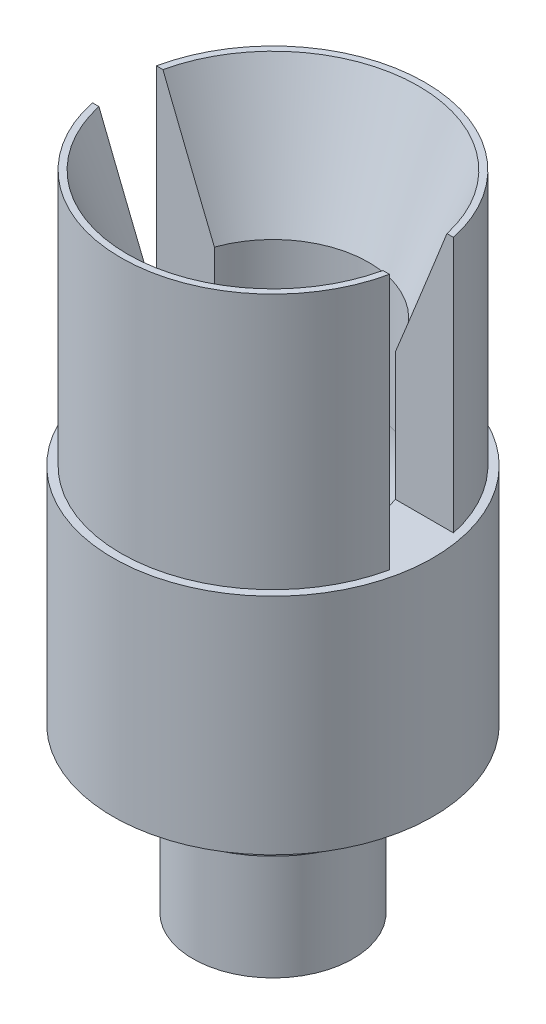
ISO-10303-21;
HEADER;
FILE_DESCRIPTION(('STEP AP214'),'2;1');
FILE_NAME('part.step','',(''),(''),'','','');
FILE_SCHEMA(('AUTOMOTIVE_DESIGN { 1 0 10303 214 1 1 1 1 }'));
ENDSEC;
DATA;
#1=APPLICATION_CONTEXT('core data for automotive mechanical design processes');
#2=APPLICATION_PROTOCOL_DEFINITION('international standard','automotive_design',2000,#1);
#3=PRODUCT_CONTEXT('',#1,'mechanical');
#4=PRODUCT('Part','Part','',(#3));
#5=PRODUCT_RELATED_PRODUCT_CATEGORY('part','',(#4));
#6=PRODUCT_DEFINITION_FORMATION('','',#4);
#7=PRODUCT_DEFINITION_CONTEXT('part definition',#1,'design');
#8=PRODUCT_DEFINITION('design','',#6,#7);
#9=PRODUCT_DEFINITION_SHAPE('','',#8);
#10=(LENGTH_UNIT() NAMED_UNIT(*) SI_UNIT(.MILLI.,.METRE.));
#11=(NAMED_UNIT(*) PLANE_ANGLE_UNIT() SI_UNIT($,.RADIAN.));
#12=(NAMED_UNIT(*) SI_UNIT($,.STERADIAN.) SOLID_ANGLE_UNIT());
#13=UNCERTAINTY_MEASURE_WITH_UNIT(LENGTH_MEASURE(1.E-05),#10,'distance_accuracy_value','');
#14=(GEOMETRIC_REPRESENTATION_CONTEXT(3) GLOBAL_UNCERTAINTY_ASSIGNED_CONTEXT((#13)) GLOBAL_UNIT_ASSIGNED_CONTEXT((#10,
#11,#12)) REPRESENTATION_CONTEXT('',''));
#15=CARTESIAN_POINT('',(0.,0.,0.));
#16=DIRECTION('',(0.,0.,1.));
#17=DIRECTION('',(1.,0.,0.));
#18=AXIS2_PLACEMENT_3D('',#15,#16,#17);
#19=CARTESIAN_POINT('',(0.,-1.29258552445077,0.));
#20=DIRECTION('',(0.,-1.,0.));
#21=DIRECTION('',(0.,0.,-1.));
#22=AXIS2_PLACEMENT_3D('',#19,#20,#21);
#23=CYLINDRICAL_SURFACE('',#22,3.);
#24=CARTESIAN_POINT('',(0.,16.1,0.));
#25=DIRECTION('',(0.,-1.,0.));
#26=DIRECTION('',(0.,0.,-1.));
#27=AXIS2_PLACEMENT_3D('',#24,#25,#26);
#28=CIRCLE('',#27,3.);
#29=CARTESIAN_POINT('',(-2.82842712474619,16.1,-1.));
#30=VERTEX_POINT('',#29);
#31=CARTESIAN_POINT('',(2.82842712474619,16.1,-1.));
#32=VERTEX_POINT('',#31);
#33=EDGE_CURVE('E142',#30,#32,#28,.T.);
#34=ORIENTED_EDGE('',*,*,#33,.F.);
#35=DIRECTION('',(0.,-1.,0.));
#36=VECTOR('',#35,1.);
#37=CARTESIAN_POINT('',(-2.82842712474619,-1.29258552445077,-1.));
#38=LINE('',#37,#36);
#39=CARTESIAN_POINT('',(-2.82842712474619,12.1,-1.));
#40=VERTEX_POINT('',#39);
#41=EDGE_CURVE('E116',#40,#30,#38,.F.);
#42=ORIENTED_EDGE('',*,*,#41,.F.);
#43=CARTESIAN_POINT('',(0.,12.1,0.));
#44=DIRECTION('',(0.,-1.,0.));
#45=DIRECTION('',(0.,0.,-1.));
#46=AXIS2_PLACEMENT_3D('',#43,#44,#45);
#47=CIRCLE('',#46,3.);
#48=CARTESIAN_POINT('',(2.82842712474619,12.1,-1.));
#49=VERTEX_POINT('',#48);
#50=EDGE_CURVE('E41',#40,#49,#47,.T.);
#51=ORIENTED_EDGE('',*,*,#50,.T.);
#52=DIRECTION('',(0.,-1.,0.));
#53=VECTOR('',#52,1.);
#54=CARTESIAN_POINT('',(2.82842712474619,-1.29258552445077,-1.));
#55=LINE('',#54,#53);
#56=EDGE_CURVE('E162',#49,#32,#55,.F.);
#57=ORIENTED_EDGE('',*,*,#56,.T.);
#58=EDGE_LOOP('',(#34,#42,#51,#57));
#59=FACE_BOUND('',#58,.T.);
#60=ADVANCED_FACE('F32',(#59),#23,.F.);
#61=CARTESIAN_POINT('',(0.,16.1,0.));
#62=DIRECTION('',(0.,1.,0.));
#63=DIRECTION('',(0.,0.,1.));
#64=AXIS2_PLACEMENT_3D('',#61,#62,#63);
#65=CONICAL_SURFACE('',#64,3.,0.369684288795301);
#66=CARTESIAN_POINT('',(0.,20.1,0.));
#67=DIRECTION('',(0.,-1.,0.));
#68=DIRECTION('',(0.,0.,-1.));
#69=AXIS2_PLACEMENT_3D('',#66,#67,#68);
#70=CIRCLE('',#69,4.55);
#71=CARTESIAN_POINT('',(-4.43874982399324,20.1,-1.));
#72=VERTEX_POINT('',#71);
#73=CARTESIAN_POINT('',(4.43874982399324,20.1,-1.));
#74=VERTEX_POINT('',#73);
#75=EDGE_CURVE('E136',#72,#74,#70,.T.);
#76=ORIENTED_EDGE('',*,*,#75,.F.);
#77=CARTESIAN_POINT('',(-1.42130511274065,12.8428280186664,-1.));
#78=CARTESIAN_POINT('',(-1.46687249735341,12.939038396171,-1.));
#79=CARTESIAN_POINT('',(-1.51187462449016,13.0355137045895,-1.));
#80=CARTESIAN_POINT('',(-1.60094963701557,13.2288890425911,-1.));
#81=CARTESIAN_POINT('',(-1.645022551832,13.3257890586062,-1.));
#82=CARTESIAN_POINT('',(-1.73243931522254,13.5199059879894,-1.));
#83=CARTESIAN_POINT('',(-1.77578322952742,13.617122871833,-1.));
#84=CARTESIAN_POINT('',(-1.8618790255143,13.8118192828097,-1.));
#85=CARTESIAN_POINT('',(-1.90463090174485,13.9092988123513,-1.));
#86=CARTESIAN_POINT('',(-2.03214641427029,14.2020169637841,-1.));
#87=CARTESIAN_POINT('',(-2.11618594382117,14.3975709275732,-1.));
#88=CARTESIAN_POINT('',(-2.28291151732341,14.7892594233278,-1.));
#89=CARTESIAN_POINT('',(-2.36559752403552,14.9853939710921,-1.));
#90=CARTESIAN_POINT('',(-2.53835038856168,15.3980946633329,-1.));
#91=CARTESIAN_POINT('',(-2.62831042752032,15.6147054841046,-1.));
#92=CARTESIAN_POINT('',(-2.80733548677005,16.0482936464627,-1.));
#93=CARTESIAN_POINT('',(-2.8964005157964,16.2652709844478,-1.));
#94=CARTESIAN_POINT('',(-3.16260720888507,16.9166581585263,-1.));
#95=CARTESIAN_POINT('',(-3.33874219795971,17.3514792002581,-1.));
#96=CARTESIAN_POINT('',(-3.68122880215228,18.2015891497653,-1.));
#97=CARTESIAN_POINT('',(-3.84765510788972,18.6168480492094,-1.));
#98=CARTESIAN_POINT('',(-4.17948286982598,19.4477753704594,-1.));
#99=CARTESIAN_POINT('',(-4.34488432522826,19.8634437925831,-1.));
#100=CARTESIAN_POINT('',(-4.6749259280216,20.6949664518623,-1.));
#101=CARTESIAN_POINT('',(-4.83956624944985,21.1108206199982,-1.));
#102=CARTESIAN_POINT('',(-5.16830298988397,21.9427421353563,-1.));
#103=CARTESIAN_POINT('',(-5.33239941091285,22.3588094817789,-1.));
#104=CARTESIAN_POINT('',(-5.49631311474116,22.774948560548,-1.));
#105=B_SPLINE_CURVE_WITH_KNOTS('',3,(#77,#78,#79,#80,#81,#82,#83,#84,#85,#86,#87,#88,#89,#90,
#91,#92,#93,#94,#95,#96,#97,#98,#99,#100,#101,#102,#103,#104),.UNSPECIFIED.,.F.,.F.,(4,2,2,2,2,
2,2,2,2,2,2,2,2,4),(0.,0.319361743391871,0.638713357494175,0.958036021007213,1.27736162286758,
1.91589524012645,2.55444639583225,3.25808939331585,3.96172551659021,5.3691405737959,
6.71124163388514,8.05334373698743,9.39512206142562,10.7368953895948),.UNSPECIFIED.);
#106=EDGE_CURVE('E111',#30,#72,#105,.T.);
#107=ORIENTED_EDGE('',*,*,#106,.F.);
#108=ORIENTED_EDGE('',*,*,#33,.T.);
#109=CARTESIAN_POINT('',(1.13854452280354,12.2686434650191,-1.));
#110=CARTESIAN_POINT('',(1.18110951610829,12.3512325143624,-1.));
#111=CARTESIAN_POINT('',(1.22289842755637,12.4342148407254,-1.));
#112=CARTESIAN_POINT('',(1.30521868303787,12.6007935396711,-1.));
#113=CARTESIAN_POINT('',(1.34575012842566,12.6843898620894,-1.));
#114=CARTESIAN_POINT('',(1.42584827978096,12.8520195506229,-1.));
#115=CARTESIAN_POINT('',(1.46541518987714,12.9360528196167,-1.));
#116=CARTESIAN_POINT('',(1.54378038572998,13.1044789405277,-1.));
#117=CARTESIAN_POINT('',(1.58257865345234,13.1888718008256,-1.));
#118=CARTESIAN_POINT('',(1.69801546041434,13.4424039413404,-1.));
#119=CARTESIAN_POINT('',(1.77372805785886,13.611964538265,-1.));
#120=CARTESIAN_POINT('',(1.92345995952192,13.9518410420272,-1.));
#121=CARTESIAN_POINT('',(1.99747915472072,14.122156996656,-1.));
#122=CARTESIAN_POINT('',(2.15085392894309,14.4785810096356,-1.));
#123=CARTESIAN_POINT('',(2.23009439398268,14.6647385442718,-1.));
#124=CARTESIAN_POINT('',(2.387503160546,15.0375003295142,-1.));
#125=CARTESIAN_POINT('',(2.46567148688999,15.2241045696613,-1.));
#126=CARTESIAN_POINT('',(2.69900152607198,15.7844668620993,-1.));
#127=CARTESIAN_POINT('',(2.8529663225196,16.1587229526121,-1.));
#128=CARTESIAN_POINT('',(3.15259808166099,16.8924611974718,-1.));
#129=CARTESIAN_POINT('',(3.29834404718119,17.2519112122027,-1.));
#130=CARTESIAN_POINT('',(3.58862413115508,17.9712999194609,-1.));
#131=CARTESIAN_POINT('',(3.73315824992082,18.3312386118623,-1.));
#132=CARTESIAN_POINT('',(4.02136485780308,19.051432353474,-1.));
#133=CARTESIAN_POINT('',(4.16503740421451,19.4116873797797,-1.));
#134=CARTESIAN_POINT('',(4.45175430338885,20.1324470655695,-1.));
#135=CARTESIAN_POINT('',(4.59479865639335,20.4929517249576,-1.));
#136=CARTESIAN_POINT('',(5.0812789872747,21.7212937548631,-1.));
#137=CARTESIAN_POINT('',(5.42360582798484,22.5895702432941,-1.));
#138=CARTESIAN_POINT('',(6.10678156681992,24.3267051282026,-1.));
#139=CARTESIAN_POINT('',(6.44763046261274,25.1955635255959,-1.));
#140=CARTESIAN_POINT('',(7.12843838758059,26.933716892008,-1.));
#141=CARTESIAN_POINT('',(7.46839733591351,27.8030118926851,-1.));
#142=CARTESIAN_POINT('',(8.14768271681911,29.54184550829,-1.));
#143=CARTESIAN_POINT('',(8.48700915161062,30.4113841223508,-1.));
#144=CARTESIAN_POINT('',(8.82616423737578,31.2809892779169,-1.));
#145=B_SPLINE_CURVE_WITH_KNOTS('',3,(#109,#110,#111,#112,#113,#114,#115,#116,#117,#118,#119,
#120,#121,#122,#123,#124,#125,#126,#127,#128,#129,#130,#131,#132,#133,#134,#135,#136,#137,#138,
#139,#140,#141,#142,#143,#144),.UNSPECIFIED.,.F.,.F.,(4,2,2,2,2,2,2,2,2,2,2,2,2,2,2,2,2,4),(0.,
0.278724820421121,0.557427116367444,0.836069908103567,1.1147192297835,1.67179302860725,
2.22890259099676,2.83585994409617,3.44280322219186,4.6568578440084,5.82047741999087,
6.98409669633825,8.14763771382566,9.31117828381937,12.1111440456248,14.9111142239979,
17.7113304881812,20.5115369107457),.UNSPECIFIED.);
#146=EDGE_CURVE('E154',#32,#74,#145,.T.);
#147=ORIENTED_EDGE('',*,*,#146,.T.);
#148=EDGE_LOOP('',(#76,#107,#108,#147));
#149=FACE_BOUND('',#148,.T.);
#150=ADVANCED_FACE('F153',(#149),#65,.F.);
#151=CARTESIAN_POINT('',(-4.75,20.1,0.));
#152=DIRECTION('',(0.,-1.,0.));
#153=DIRECTION('',(0.,0.,-1.));
#154=AXIS2_PLACEMENT_3D('',#151,#152,#153);
#155=PLANE('',#154);
#156=CARTESIAN_POINT('',(0.,20.1,0.));
#157=DIRECTION('',(0.,-1.,0.));
#158=DIRECTION('',(0.,0.,-1.));
#159=AXIS2_PLACEMENT_3D('',#156,#157,#158);
#160=CIRCLE('',#159,4.75);
#161=CARTESIAN_POINT('',(-4.64354390525168,20.1,-1.));
#162=VERTEX_POINT('',#161);
#163=CARTESIAN_POINT('',(4.64354390525168,20.1,-1.));
#164=VERTEX_POINT('',#163);
#165=EDGE_CURVE('E122',#162,#164,#160,.T.);
#166=ORIENTED_EDGE('',*,*,#165,.F.);
#167=DIRECTION('',(1.,0.,0.));
#168=VECTOR('',#167,1.);
#169=CARTESIAN_POINT('',(-5.001,20.1,-1.));
#170=LINE('',#169,#168);
#171=EDGE_CURVE('E108',#162,#72,#170,.T.);
#172=ORIENTED_EDGE('',*,*,#171,.T.);
#173=ORIENTED_EDGE('',*,*,#75,.T.);
#174=DIRECTION('',(-1.,0.,0.));
#175=VECTOR('',#174,1.);
#176=CARTESIAN_POINT('',(5.001,20.1,-1.));
#177=LINE('',#176,#175);
#178=EDGE_CURVE('E131',#164,#74,#177,.T.);
#179=ORIENTED_EDGE('',*,*,#178,.F.);
#180=EDGE_LOOP('',(#166,#172,#173,#179));
#181=FACE_BOUND('',#180,.T.);
#182=ADVANCED_FACE('F129',(#181),#155,.F.);
#183=CARTESIAN_POINT('',(0.,-1.29258552445077,0.));
#184=DIRECTION('',(0.,-1.,0.));
#185=DIRECTION('',(0.,0.,-1.));
#186=AXIS2_PLACEMENT_3D('',#183,#184,#185);
#187=CYLINDRICAL_SURFACE('',#186,4.75);
#188=CARTESIAN_POINT('',(0.,12.1,0.));
#189=DIRECTION('',(0.,-1.,0.));
#190=DIRECTION('',(0.,0.,-1.));
#191=AXIS2_PLACEMENT_3D('',#188,#189,#190);
#192=CIRCLE('',#191,4.75);
#193=CARTESIAN_POINT('',(-4.64354390525168,12.1,-1.));
#194=VERTEX_POINT('',#193);
#195=CARTESIAN_POINT('',(4.64354390525168,12.1,-1.));
#196=VERTEX_POINT('',#195);
#197=EDGE_CURVE('E124',#194,#196,#192,.T.);
#198=ORIENTED_EDGE('',*,*,#197,.F.);
#199=DIRECTION('',(0.,-1.,0.));
#200=VECTOR('',#199,1.);
#201=CARTESIAN_POINT('',(-4.64354390525168,-1.29258552445077,-1.));
#202=LINE('',#201,#200);
#203=EDGE_CURVE('E48',#162,#194,#202,.T.);
#204=ORIENTED_EDGE('',*,*,#203,.F.);
#205=ORIENTED_EDGE('',*,*,#165,.T.);
#206=DIRECTION('',(0.,-1.,0.));
#207=VECTOR('',#206,1.);
#208=CARTESIAN_POINT('',(4.64354390525168,-1.29258552445077,-1.));
#209=LINE('',#208,#207);
#210=EDGE_CURVE('E170',#164,#196,#209,.T.);
#211=ORIENTED_EDGE('',*,*,#210,.T.);
#212=EDGE_LOOP('',(#198,#204,#205,#211));
#213=FACE_BOUND('',#212,.T.);
#214=ADVANCED_FACE('F120',(#213),#187,.T.);
#215=CARTESIAN_POINT('',(2.82842712474619,12.1,1.));
#216=VERTEX_POINT('',#215);
#217=CARTESIAN_POINT('',(-2.82842712474619,12.1,1.));
#218=VERTEX_POINT('',#217);
#219=EDGE_CURVE('E40',#216,#218,#47,.T.);
#220=ORIENTED_EDGE('',*,*,#219,.T.);
#221=DIRECTION('',(0.,-1.,0.));
#222=VECTOR('',#221,1.);
#223=CARTESIAN_POINT('',(-2.82842712474619,-1.29258552445077,1.));
#224=LINE('',#223,#222);
#225=CARTESIAN_POINT('',(-2.82842712474619,16.1,1.));
#226=VERTEX_POINT('',#225);
#227=EDGE_CURVE('E224',#226,#218,#224,.T.);
#228=ORIENTED_EDGE('',*,*,#227,.F.);
#229=CARTESIAN_POINT('',(2.82842712474619,16.1,1.));
#230=VERTEX_POINT('',#229);
#231=EDGE_CURVE('E143',#230,#226,#28,.T.);
#232=ORIENTED_EDGE('',*,*,#231,.F.);
#233=DIRECTION('',(0.,-1.,0.));
#234=VECTOR('',#233,1.);
#235=CARTESIAN_POINT('',(2.82842712474619,-1.29258552445077,1.));
#236=LINE('',#235,#234);
#237=EDGE_CURVE('E167',#230,#216,#236,.T.);
#238=ORIENTED_EDGE('',*,*,#237,.T.);
#239=EDGE_LOOP('',(#220,#228,#232,#238));
#240=FACE_BOUND('',#239,.T.);
#241=ADVANCED_FACE('F254',(#240),#23,.F.);
#242=ORIENTED_EDGE('',*,*,#231,.T.);
#243=CARTESIAN_POINT('',(-5.49631311474116,22.774948560548,1.));
#244=CARTESIAN_POINT('',(-5.33236726545176,22.3587281029965,1.));
#245=CARTESIAN_POINT('',(-5.16823874175081,21.942579352962,1.));
#246=CARTESIAN_POINT('',(-4.83944129181858,21.1105045974139,1.));
#247=CARTESIAN_POINT('',(-4.67477237593511,20.6945785878105,1.));
#248=CARTESIAN_POINT('',(-4.34473371115412,19.8630653247091,1.));
#249=CARTESIAN_POINT('',(-4.17936405343854,19.4474780350484,1.));
#250=CARTESIAN_POINT('',(-3.84759753995541,18.6167037010042,1.));
#251=CARTESIAN_POINT('',(-3.68120066338843,18.2015166649233,1.));
#252=CARTESIAN_POINT('',(-3.34687229084607,17.3716621125102,1.));
#253=CARTESIAN_POINT('',(-3.17894049204518,16.9569947178852,1.));
#254=CARTESIAN_POINT('',(-2.92525670509561,16.3357348530482,1.));
#255=CARTESIAN_POINT('',(-2.84039992750452,16.1287769880307,1.));
#256=CARTESIAN_POINT('',(-2.66990318591931,15.7151812338595,1.));
#257=CARTESIAN_POINT('',(-2.58426321386999,15.5085433480224,1.));
#258=CARTESIAN_POINT('',(-2.41192883440908,15.0956615514361,1.));
#259=CARTESIAN_POINT('',(-2.3252342310374,14.8894177224052,1.));
#260=CARTESIAN_POINT('',(-2.15042424810812,14.4775379071066,1.));
#261=CARTESIAN_POINT('',(-2.06230890890322,14.2719019037707,1.));
#262=CARTESIAN_POINT('',(-1.92858869398113,13.9640980418999,1.));
#263=CARTESIAN_POINT('',(-1.88375335520285,13.8615960026051,1.));
#264=CARTESIAN_POINT('',(-1.793448569176,13.6568726203993,1.));
#265=CARTESIAN_POINT('',(-1.74797912833147,13.5546512746659,1.));
#266=CARTESIAN_POINT('',(-1.65625337528665,13.3505495186559,1.));
#267=CARTESIAN_POINT('',(-1.60999698836632,13.2486691418656,1.));
#268=CARTESIAN_POINT('',(-1.51646942486943,13.045371429397,1.));
#269=CARTESIAN_POINT('',(-1.46919821302836,12.9439541099586,1.));
#270=CARTESIAN_POINT('',(-1.42130511274065,12.8428280186664,1.));
#271=B_SPLINE_CURVE_WITH_KNOTS('',3,(#243,#244,#245,#246,#247,#248,#249,#250,#251,#252,#253,
#254,#255,#256,#257,#258,#259,#260,#261,#262,#263,#264,#265,#266,#267,#268,#269,#270),
.UNSPECIFIED.,.F.,.F.,(4,2,2,2,2,2,2,2,2,2,2,2,2,4),(0.,1.34203583568066,2.68404612132428,
4.0258868388083,5.36775481599973,6.70989350491945,7.38092894725191,8.05197129900564,
8.72314030112211,9.39429027371374,9.72992510987281,10.065556558782,10.4012200555422,
10.7368952353296),.UNSPECIFIED.);
#272=CARTESIAN_POINT('',(-4.43874982399324,20.1,1.));
#273=VERTEX_POINT('',#272);
#274=EDGE_CURVE('E125',#273,#226,#271,.T.);
#275=ORIENTED_EDGE('',*,*,#274,.F.);
#276=CARTESIAN_POINT('',(4.43874982399324,20.1,1.));
#277=VERTEX_POINT('',#276);
#278=EDGE_CURVE('E140',#277,#273,#70,.T.);
#279=ORIENTED_EDGE('',*,*,#278,.F.);
#280=CARTESIAN_POINT('',(1.13854452280354,12.2686434650191,1.));
#281=CARTESIAN_POINT('',(1.18110951610829,12.3512325143624,1.));
#282=CARTESIAN_POINT('',(1.22289842755637,12.4342148407254,1.));
#283=CARTESIAN_POINT('',(1.30521868303787,12.6007935396711,1.));
#284=CARTESIAN_POINT('',(1.34575012842566,12.6843898620894,1.));
#285=CARTESIAN_POINT('',(1.42584827978096,12.8520195506229,1.));
#286=CARTESIAN_POINT('',(1.46541518987714,12.9360528196167,1.));
#287=CARTESIAN_POINT('',(1.54378038572998,13.1044789405277,1.));
#288=CARTESIAN_POINT('',(1.58257865345234,13.1888718008256,1.));
#289=CARTESIAN_POINT('',(1.69801546041434,13.4424039413404,1.));
#290=CARTESIAN_POINT('',(1.77372805785886,13.611964538265,1.));
#291=CARTESIAN_POINT('',(1.92345995952192,13.9518410420272,1.));
#292=CARTESIAN_POINT('',(1.99747915472072,14.122156996656,1.));
#293=CARTESIAN_POINT('',(2.15085392894309,14.4785810096356,1.));
#294=CARTESIAN_POINT('',(2.23009439398268,14.6647385442718,1.));
#295=CARTESIAN_POINT('',(2.387503160546,15.0375003295142,1.));
#296=CARTESIAN_POINT('',(2.46567148688999,15.2241045696613,1.));
#297=CARTESIAN_POINT('',(2.69900152607198,15.7844668620993,1.));
#298=CARTESIAN_POINT('',(2.8529663225196,16.1587229526121,1.));
#299=CARTESIAN_POINT('',(3.15259808166099,16.8924611974718,1.));
#300=CARTESIAN_POINT('',(3.29834404718119,17.2519112122027,1.));
#301=CARTESIAN_POINT('',(3.58862413115508,17.9712999194609,1.));
#302=CARTESIAN_POINT('',(3.73315824992082,18.3312386118623,1.));
#303=CARTESIAN_POINT('',(4.02136485780308,19.051432353474,1.));
#304=CARTESIAN_POINT('',(4.16503740421451,19.4116873797797,1.));
#305=CARTESIAN_POINT('',(4.45175430338885,20.1324470655695,1.));
#306=CARTESIAN_POINT('',(4.59479865639335,20.4929517249576,1.));
#307=CARTESIAN_POINT('',(5.0812789872747,21.7212937548631,1.));
#308=CARTESIAN_POINT('',(5.42360582798484,22.5895702432941,1.));
#309=CARTESIAN_POINT('',(6.10678156681992,24.3267051282026,1.));
#310=CARTESIAN_POINT('',(6.44763046261274,25.1955635255959,1.));
#311=CARTESIAN_POINT('',(7.12843838758059,26.933716892008,1.));
#312=CARTESIAN_POINT('',(7.46839733591351,27.8030118926851,1.));
#313=CARTESIAN_POINT('',(8.14768271681911,29.54184550829,1.));
#314=CARTESIAN_POINT('',(8.48700915161062,30.4113841223508,1.));
#315=CARTESIAN_POINT('',(8.82616423737578,31.2809892779169,1.));
#316=B_SPLINE_CURVE_WITH_KNOTS('',3,(#280,#281,#282,#283,#284,#285,#286,#287,#288,#289,#290,
#291,#292,#293,#294,#295,#296,#297,#298,#299,#300,#301,#302,#303,#304,#305,#306,#307,#308,#309,
#310,#311,#312,#313,#314,#315),.UNSPECIFIED.,.F.,.F.,(4,2,2,2,2,2,2,2,2,2,2,2,2,2,2,2,2,4),(0.,
0.278724820421121,0.557427116367444,0.836069908103567,1.1147192297835,1.67179302860725,
2.22890259099676,2.83585994409617,3.44280322219186,4.6568578440084,5.82047741999087,
6.98409669633825,8.14763771382566,9.31117828381937,12.1111440456248,14.9111142239979,
17.7113304881812,20.5115369107457),.UNSPECIFIED.);
#317=EDGE_CURVE('E192',#277,#230,#316,.F.);
#318=ORIENTED_EDGE('',*,*,#317,.T.);
#319=EDGE_LOOP('',(#242,#275,#279,#318));
#320=FACE_BOUND('',#319,.T.);
#321=ADVANCED_FACE('F259',(#320),#65,.F.);
#322=ORIENTED_EDGE('',*,*,#278,.T.);
#323=DIRECTION('',(1.,0.,0.));
#324=VECTOR('',#323,1.);
#325=CARTESIAN_POINT('',(-5.001,20.1,1.));
#326=LINE('',#325,#324);
#327=CARTESIAN_POINT('',(-4.64354390525168,20.1,1.));
#328=VERTEX_POINT('',#327);
#329=EDGE_CURVE('E115',#328,#273,#326,.T.);
#330=ORIENTED_EDGE('',*,*,#329,.F.);
#331=CARTESIAN_POINT('',(4.64354390525168,20.1,1.));
#332=VERTEX_POINT('',#331);
#333=EDGE_CURVE('E132',#332,#328,#160,.T.);
#334=ORIENTED_EDGE('',*,*,#333,.F.);
#335=DIRECTION('',(-1.,0.,0.));
#336=VECTOR('',#335,1.);
#337=CARTESIAN_POINT('',(5.001,20.1,1.));
#338=LINE('',#337,#336);
#339=EDGE_CURVE('E286',#332,#277,#338,.T.);
#340=ORIENTED_EDGE('',*,*,#339,.T.);
#341=EDGE_LOOP('',(#322,#330,#334,#340));
#342=FACE_BOUND('',#341,.T.);
#343=ADVANCED_FACE('F266',(#342),#155,.F.);
#344=ORIENTED_EDGE('',*,*,#333,.T.);
#345=DIRECTION('',(0.,-1.,0.));
#346=VECTOR('',#345,1.);
#347=CARTESIAN_POINT('',(-4.64354390525168,-1.29258552445077,1.));
#348=LINE('',#347,#346);
#349=CARTESIAN_POINT('',(-4.64354390525168,12.1,1.));
#350=VERTEX_POINT('',#349);
#351=EDGE_CURVE('E126',#350,#328,#348,.F.);
#352=ORIENTED_EDGE('',*,*,#351,.F.);
#353=CARTESIAN_POINT('',(4.64354390525168,12.1,1.));
#354=VERTEX_POINT('',#353);
#355=EDGE_CURVE('E133',#354,#350,#192,.T.);
#356=ORIENTED_EDGE('',*,*,#355,.F.);
#357=DIRECTION('',(0.,-1.,0.));
#358=VECTOR('',#357,1.);
#359=CARTESIAN_POINT('',(4.64354390525168,-1.29258552445077,1.));
#360=LINE('',#359,#358);
#361=EDGE_CURVE('E222',#354,#332,#360,.F.);
#362=ORIENTED_EDGE('',*,*,#361,.T.);
#363=EDGE_LOOP('',(#344,#352,#356,#362));
#364=FACE_BOUND('',#363,.T.);
#365=ADVANCED_FACE('F268',(#364),#187,.T.);
#366=CARTESIAN_POINT('',(0.,12.1,0.));
#367=DIRECTION('',(0.,-1.,0.));
#368=DIRECTION('',(-1.,0.,0.));
#369=AXIS2_PLACEMENT_3D('',#366,#367,#368);
#370=SPHERICAL_SURFACE('',#369,3.);
#371=EDGE_CURVE('E11',#49,#216,#47,.T.);
#372=ORIENTED_EDGE('',*,*,#371,.F.);
#373=ORIENTED_EDGE('',*,*,#50,.F.);
#374=CARTESIAN_POINT('',(0.,12.1,0.));
#375=DIRECTION('',(0.,-1.,0.));
#376=DIRECTION('',(0.,0.,-1.));
#377=AXIS2_PLACEMENT_3D('',#374,#375,#376);
#378=CIRCLE('',#377,3.);
#379=EDGE_CURVE('E274',#218,#40,#378,.T.);
#380=ORIENTED_EDGE('',*,*,#379,.F.);
#381=ORIENTED_EDGE('',*,*,#219,.F.);
#382=EDGE_LOOP('',(#372,#373,#380,#381));
#383=FACE_BOUND('',#382,.T.);
#384=ADVANCED_FACE('F34',(#383),#370,.F.);
#385=CARTESIAN_POINT('',(-5.,12.1,0.));
#386=DIRECTION('',(0.,-1.,0.));
#387=DIRECTION('',(0.,0.,-1.));
#388=AXIS2_PLACEMENT_3D('',#385,#386,#387);
#389=PLANE('',#388);
#390=CARTESIAN_POINT('',(0.,12.1,0.));
#391=DIRECTION('',(0.,-1.,0.));
#392=DIRECTION('',(0.,0.,-1.));
#393=AXIS2_PLACEMENT_3D('',#390,#391,#392);
#394=CIRCLE('',#393,5.);
#395=CARTESIAN_POINT('',(0.,12.1,-5.));
#396=VERTEX_POINT('',#395);
#397=EDGE_CURVE('E214',#396,#396,#394,.T.);
#398=ORIENTED_EDGE('',*,*,#397,.F.);
#399=EDGE_LOOP('',(#398));
#400=FACE_BOUND('',#399,.T.);
#401=ORIENTED_EDGE('',*,*,#355,.T.);
#402=DIRECTION('',(1.,0.,0.));
#403=VECTOR('',#402,1.);
#404=CARTESIAN_POINT('',(-5.001,12.1,1.));
#405=LINE('',#404,#403);
#406=EDGE_CURVE('E230',#350,#218,#405,.T.);
#407=ORIENTED_EDGE('',*,*,#406,.T.);
#408=ORIENTED_EDGE('',*,*,#379,.T.);
#409=DIRECTION('',(1.,0.,0.));
#410=VECTOR('',#409,1.);
#411=CARTESIAN_POINT('',(-5.001,12.1,-1.));
#412=LINE('',#411,#410);
#413=EDGE_CURVE('E221',#194,#40,#412,.T.);
#414=ORIENTED_EDGE('',*,*,#413,.F.);
#415=ORIENTED_EDGE('',*,*,#197,.T.);
#416=DIRECTION('',(-1.,0.,0.));
#417=VECTOR('',#416,1.);
#418=CARTESIAN_POINT('',(5.001,12.1,-1.));
#419=LINE('',#418,#417);
#420=EDGE_CURVE('E164',#196,#49,#419,.T.);
#421=ORIENTED_EDGE('',*,*,#420,.T.);
#422=ORIENTED_EDGE('',*,*,#371,.T.);
#423=DIRECTION('',(-1.,0.,0.));
#424=VECTOR('',#423,1.);
#425=CARTESIAN_POINT('',(5.001,12.1,1.));
#426=LINE('',#425,#424);
#427=EDGE_CURVE('E55',#354,#216,#426,.T.);
#428=ORIENTED_EDGE('',*,*,#427,.F.);
#429=EDGE_LOOP('',(#401,#407,#408,#414,#415,#421,#422,#428));
#430=FACE_BOUND('',#429,.T.);
#431=ADVANCED_FACE('F218',(#400,#430),#389,.F.);
#432=CARTESIAN_POINT('',(0.,-1.29258552445077,0.));
#433=DIRECTION('',(0.,-1.,0.));
#434=DIRECTION('',(0.,0.,-1.));
#435=AXIS2_PLACEMENT_3D('',#432,#433,#434);
#436=CYLINDRICAL_SURFACE('',#435,5.);
#437=CARTESIAN_POINT('',(0.,5.1,0.));
#438=DIRECTION('',(0.,-1.,0.));
#439=DIRECTION('',(0.,0.,-1.));
#440=AXIS2_PLACEMENT_3D('',#437,#438,#439);
#441=CIRCLE('',#440,5.);
#442=CARTESIAN_POINT('',(0.,5.1,-5.));
#443=VERTEX_POINT('',#442);
#444=EDGE_CURVE('E212',#443,#443,#441,.T.);
#445=ORIENTED_EDGE('',*,*,#444,.F.);
#446=EDGE_LOOP('',(#445));
#447=FACE_BOUND('',#446,.T.);
#448=ORIENTED_EDGE('',*,*,#397,.T.);
#449=EDGE_LOOP('',(#448));
#450=FACE_BOUND('',#449,.T.);
#451=ADVANCED_FACE('F314',(#447,#450),#436,.T.);
#452=CARTESIAN_POINT('',(-3.5,5.1,0.));
#453=DIRECTION('',(0.,1.,0.));
#454=DIRECTION('',(0.,0.,1.));
#455=AXIS2_PLACEMENT_3D('',#452,#453,#454);
#456=PLANE('',#455);
#457=CARTESIAN_POINT('',(0.,5.1,0.));
#458=DIRECTION('',(0.,-1.,0.));
#459=DIRECTION('',(0.,0.,-1.));
#460=AXIS2_PLACEMENT_3D('',#457,#458,#459);
#461=CIRCLE('',#460,3.5);
#462=CARTESIAN_POINT('',(0.,5.1,-3.5));
#463=VERTEX_POINT('',#462);
#464=EDGE_CURVE('E209',#463,#463,#461,.T.);
#465=ORIENTED_EDGE('',*,*,#464,.F.);
#466=EDGE_LOOP('',(#465));
#467=FACE_BOUND('',#466,.T.);
#468=ORIENTED_EDGE('',*,*,#444,.T.);
#469=EDGE_LOOP('',(#468));
#470=FACE_BOUND('',#469,.T.);
#471=ADVANCED_FACE('F310',(#467,#470),#456,.F.);
#472=CARTESIAN_POINT('',(0.,-1.29258552445077,0.));
#473=DIRECTION('',(0.,-1.,0.));
#474=DIRECTION('',(0.,0.,-1.));
#475=AXIS2_PLACEMENT_3D('',#472,#473,#474);
#476=CYLINDRICAL_SURFACE('',#475,3.5);
#477=CARTESIAN_POINT('',(0.,4.,0.));
#478=DIRECTION('',(0.,-1.,0.));
#479=DIRECTION('',(0.,0.,-1.));
#480=AXIS2_PLACEMENT_3D('',#477,#478,#479);
#481=CIRCLE('',#480,3.5);
#482=CARTESIAN_POINT('',(0.,4.,-3.5));
#483=VERTEX_POINT('',#482);
#484=EDGE_CURVE('E206',#483,#483,#481,.T.);
#485=ORIENTED_EDGE('',*,*,#484,.F.);
#486=EDGE_LOOP('',(#485));
#487=FACE_BOUND('',#486,.T.);
#488=ORIENTED_EDGE('',*,*,#464,.T.);
#489=EDGE_LOOP('',(#488));
#490=FACE_BOUND('',#489,.T.);
#491=ADVANCED_FACE('F306',(#487,#490),#476,.T.);
#492=CARTESIAN_POINT('',(-2.5,4.,0.));
#493=DIRECTION('',(0.,1.,0.));
#494=DIRECTION('',(0.,0.,1.));
#495=AXIS2_PLACEMENT_3D('',#492,#493,#494);
#496=PLANE('',#495);
#497=CARTESIAN_POINT('',(0.,4.,0.));
#498=DIRECTION('',(0.,-1.,0.));
#499=DIRECTION('',(0.,0.,-1.));
#500=AXIS2_PLACEMENT_3D('',#497,#498,#499);
#501=CIRCLE('',#500,2.5);
#502=CARTESIAN_POINT('',(0.,4.,-2.5));
#503=VERTEX_POINT('',#502);
#504=EDGE_CURVE('E203',#503,#503,#501,.T.);
#505=ORIENTED_EDGE('',*,*,#504,.F.);
#506=EDGE_LOOP('',(#505));
#507=FACE_BOUND('',#506,.T.);
#508=ORIENTED_EDGE('',*,*,#484,.T.);
#509=EDGE_LOOP('',(#508));
#510=FACE_BOUND('',#509,.T.);
#511=ADVANCED_FACE('F300',(#507,#510),#496,.F.);
#512=CARTESIAN_POINT('',(0.,-1.29258552445077,0.));
#513=DIRECTION('',(0.,-1.,0.));
#514=DIRECTION('',(0.,0.,-1.));
#515=AXIS2_PLACEMENT_3D('',#512,#513,#514);
#516=CYLINDRICAL_SURFACE('',#515,2.5);
#517=CARTESIAN_POINT('',(0.,0.,0.));
#518=DIRECTION('',(0.,-1.,0.));
#519=DIRECTION('',(0.,0.,-1.));
#520=AXIS2_PLACEMENT_3D('',#517,#518,#519);
#521=CIRCLE('',#520,2.5);
#522=CARTESIAN_POINT('',(0.,0.,-2.5));
#523=VERTEX_POINT('',#522);
#524=EDGE_CURVE('E199',#523,#523,#521,.T.);
#525=ORIENTED_EDGE('',*,*,#524,.F.);
#526=EDGE_LOOP('',(#525));
#527=FACE_BOUND('',#526,.T.);
#528=ORIENTED_EDGE('',*,*,#504,.T.);
#529=EDGE_LOOP('',(#528));
#530=FACE_BOUND('',#529,.T.);
#531=ADVANCED_FACE('F295',(#527,#530),#516,.T.);
#532=CARTESIAN_POINT('',(0.,0.,0.));
#533=DIRECTION('',(0.,1.,0.));
#534=DIRECTION('',(0.,0.,1.));
#535=AXIS2_PLACEMENT_3D('',#532,#533,#534);
#536=PLANE('',#535);
#537=ORIENTED_EDGE('',*,*,#524,.T.);
#538=EDGE_LOOP('',(#537));
#539=FACE_BOUND('',#538,.T.);
#540=ADVANCED_FACE('F291',(#539),#536,.F.);
#541=CARTESIAN_POINT('',(5.001,12.1,-1.));
#542=DIRECTION('',(0.,0.,1.));
#543=DIRECTION('',(1.,0.,0.));
#544=AXIS2_PLACEMENT_3D('',#541,#542,#543);
#545=PLANE('',#544);
#546=ORIENTED_EDGE('',*,*,#420,.F.);
#547=ORIENTED_EDGE('',*,*,#210,.F.);
#548=ORIENTED_EDGE('',*,*,#178,.T.);
#549=ORIENTED_EDGE('',*,*,#146,.F.);
#550=ORIENTED_EDGE('',*,*,#56,.F.);
#551=EDGE_LOOP('',(#546,#547,#548,#549,#550));
#552=FACE_BOUND('',#551,.T.);
#553=ADVANCED_FACE('F161',(#552),#545,.T.);
#554=CARTESIAN_POINT('',(5.001,12.1,1.));
#555=DIRECTION('',(0.,0.,-1.));
#556=DIRECTION('',(-1.,0.,0.));
#557=AXIS2_PLACEMENT_3D('',#554,#555,#556);
#558=PLANE('',#557);
#559=ORIENTED_EDGE('',*,*,#317,.F.);
#560=ORIENTED_EDGE('',*,*,#339,.F.);
#561=ORIENTED_EDGE('',*,*,#361,.F.);
#562=ORIENTED_EDGE('',*,*,#427,.T.);
#563=ORIENTED_EDGE('',*,*,#237,.F.);
#564=EDGE_LOOP('',(#559,#560,#561,#562,#563));
#565=FACE_BOUND('',#564,.T.);
#566=ADVANCED_FACE('F188',(#565),#558,.T.);
#567=CARTESIAN_POINT('',(-5.001,12.1,-1.));
#568=DIRECTION('',(0.,0.,-1.));
#569=DIRECTION('',(-1.,0.,0.));
#570=AXIS2_PLACEMENT_3D('',#567,#568,#569);
#571=PLANE('',#570);
#572=ORIENTED_EDGE('',*,*,#41,.T.);
#573=ORIENTED_EDGE('',*,*,#106,.T.);
#574=ORIENTED_EDGE('',*,*,#171,.F.);
#575=ORIENTED_EDGE('',*,*,#203,.T.);
#576=ORIENTED_EDGE('',*,*,#413,.T.);
#577=EDGE_LOOP('',(#572,#573,#574,#575,#576));
#578=FACE_BOUND('',#577,.T.);
#579=ADVANCED_FACE('F109',(#578),#571,.F.);
#580=CARTESIAN_POINT('',(-5.001,12.1,1.));
#581=DIRECTION('',(0.,0.,1.));
#582=DIRECTION('',(1.,0.,0.));
#583=AXIS2_PLACEMENT_3D('',#580,#581,#582);
#584=PLANE('',#583);
#585=ORIENTED_EDGE('',*,*,#227,.T.);
#586=ORIENTED_EDGE('',*,*,#406,.F.);
#587=ORIENTED_EDGE('',*,*,#351,.T.);
#588=ORIENTED_EDGE('',*,*,#329,.T.);
#589=ORIENTED_EDGE('',*,*,#274,.T.);
#590=EDGE_LOOP('',(#585,#586,#587,#588,#589));
#591=FACE_BOUND('',#590,.T.);
#592=ADVANCED_FACE('F245',(#591),#584,.F.);
#593=CLOSED_SHELL('',(#60,#150,#182,#214,#241,#321,#343,#365,#384,#431,#451,#471,#491,#511,#531,
#540,#553,#566,#579,#592));
#594=MANIFOLD_SOLID_BREP('B2',#593);
#595=ADVANCED_BREP_SHAPE_REPRESENTATION('',(#18,#594),#14);
#596=SHAPE_DEFINITION_REPRESENTATION(#9,#595);
ENDSEC;
END-ISO-10303-21;
